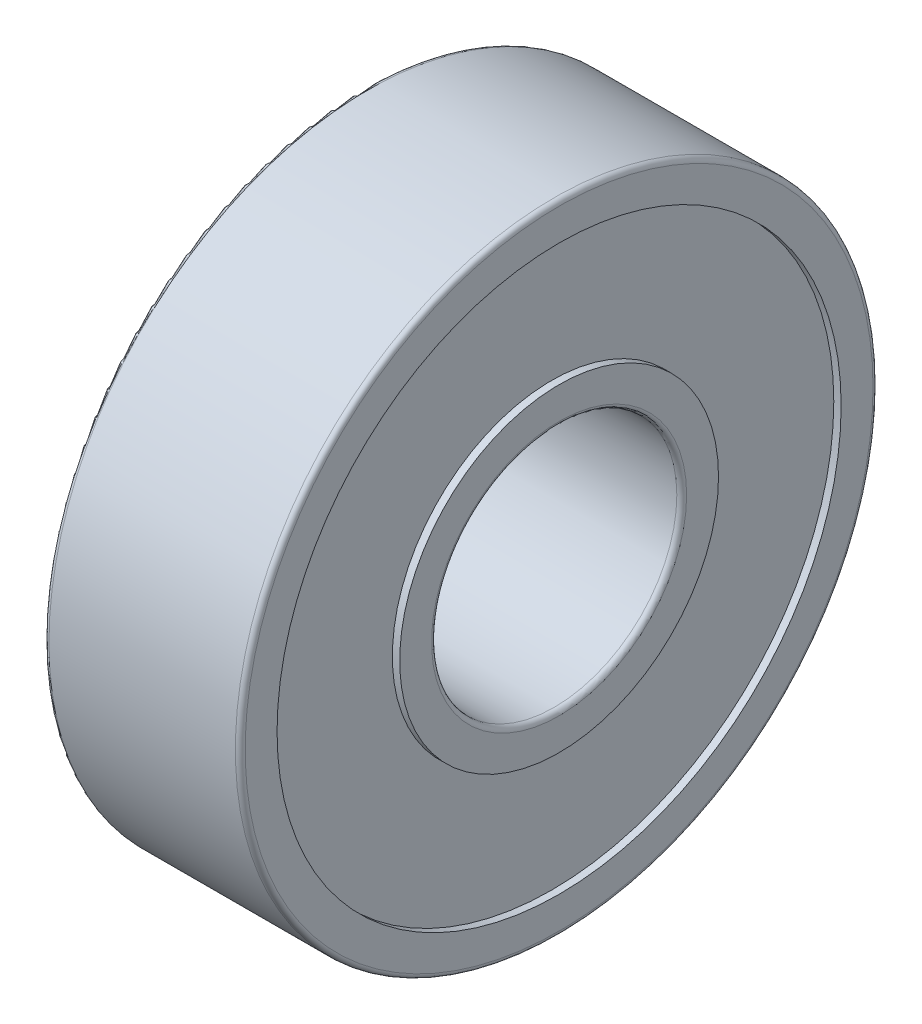
ISO-10303-21;
HEADER;
FILE_DESCRIPTION(('STEP AP214'),'2;1');
FILE_NAME('part.step','',(''),(''),'','','');
FILE_SCHEMA(('AUTOMOTIVE_DESIGN { 1 0 10303 214 1 1 1 1 }'));
ENDSEC;
DATA;
#1=APPLICATION_CONTEXT('core data for automotive mechanical design processes');
#2=APPLICATION_PROTOCOL_DEFINITION('international standard','automotive_design',2000,#1);
#3=PRODUCT_CONTEXT('',#1,'mechanical');
#4=PRODUCT('Part','Part','',(#3));
#5=PRODUCT_RELATED_PRODUCT_CATEGORY('part','',(#4));
#6=PRODUCT_DEFINITION_FORMATION('','',#4);
#7=PRODUCT_DEFINITION_CONTEXT('part definition',#1,'design');
#8=PRODUCT_DEFINITION('design','',#6,#7);
#9=PRODUCT_DEFINITION_SHAPE('','',#8);
#10=(LENGTH_UNIT() NAMED_UNIT(*) SI_UNIT(.MILLI.,.METRE.));
#11=(NAMED_UNIT(*) PLANE_ANGLE_UNIT() SI_UNIT($,.RADIAN.));
#12=(NAMED_UNIT(*) SI_UNIT($,.STERADIAN.) SOLID_ANGLE_UNIT());
#13=UNCERTAINTY_MEASURE_WITH_UNIT(LENGTH_MEASURE(1.E-05),#10,'distance_accuracy_value','');
#14=(GEOMETRIC_REPRESENTATION_CONTEXT(3) GLOBAL_UNCERTAINTY_ASSIGNED_CONTEXT((#13)) GLOBAL_UNIT_ASSIGNED_CONTEXT((#10,
#11,#12)) REPRESENTATION_CONTEXT('',''));
#15=CARTESIAN_POINT('',(0.,0.,0.));
#16=DIRECTION('',(0.,0.,1.));
#17=DIRECTION('',(1.,0.,0.));
#18=AXIS2_PLACEMENT_3D('',#15,#16,#17);
#19=CARTESIAN_POINT('',(-4.,5.,0.));
#20=DIRECTION('',(-1.,0.,0.));
#21=DIRECTION('',(0.,0.,1.));
#22=AXIS2_PLACEMENT_3D('',#19,#20,#21);
#23=PLANE('',#22);
#24=CARTESIAN_POINT('',(-4.,0.,0.));
#25=DIRECTION('',(-1.,0.,0.));
#26=DIRECTION('',(0.,0.,1.));
#27=AXIS2_PLACEMENT_3D('',#24,#25,#26);
#28=CIRCLE('',#27,5.2);
#29=CARTESIAN_POINT('',(-4.,0.,5.2));
#30=VERTEX_POINT('',#29);
#31=EDGE_CURVE('E65',#30,#30,#28,.F.);
#32=ORIENTED_EDGE('',*,*,#31,.T.);
#33=EDGE_LOOP('',(#32));
#34=FACE_BOUND('',#33,.T.);
#35=CARTESIAN_POINT('',(-4.,0.,0.));
#36=DIRECTION('',(1.,0.,0.));
#37=DIRECTION('',(0.,0.,-1.));
#38=AXIS2_PLACEMENT_3D('',#35,#36,#37);
#39=CIRCLE('',#38,6.5);
#40=CARTESIAN_POINT('',(-4.,0.,-6.5));
#41=VERTEX_POINT('',#40);
#42=EDGE_CURVE('E68',#41,#41,#39,.T.);
#43=ORIENTED_EDGE('',*,*,#42,.F.);
#44=EDGE_LOOP('',(#43));
#45=FACE_BOUND('',#44,.T.);
#46=ADVANCED_FACE('F36',(#34,#45),#23,.T.);
#47=CARTESIAN_POINT('',(0.,0.,0.));
#48=DIRECTION('',(1.,0.,0.));
#49=DIRECTION('',(0.,0.,-1.));
#50=AXIS2_PLACEMENT_3D('',#47,#48,#49);
#51=CYLINDRICAL_SURFACE('',#50,6.5);
#52=ORIENTED_EDGE('',*,*,#42,.T.);
#53=EDGE_LOOP('',(#52));
#54=FACE_BOUND('',#53,.T.);
#55=CARTESIAN_POINT('',(-3.7,0.,0.));
#56=DIRECTION('',(1.,0.,0.));
#57=DIRECTION('',(0.,0.,-1.));
#58=AXIS2_PLACEMENT_3D('',#55,#56,#57);
#59=CIRCLE('',#58,6.5);
#60=CARTESIAN_POINT('',(-3.7,0.,-6.5));
#61=VERTEX_POINT('',#60);
#62=EDGE_CURVE('E71',#61,#61,#59,.T.);
#63=ORIENTED_EDGE('',*,*,#62,.F.);
#64=EDGE_LOOP('',(#63));
#65=FACE_BOUND('',#64,.T.);
#66=ADVANCED_FACE('F111',(#54,#65),#51,.T.);
#67=CARTESIAN_POINT('',(-3.7,6.5,0.));
#68=DIRECTION('',(-1.,0.,0.));
#69=DIRECTION('',(0.,0.,1.));
#70=AXIS2_PLACEMENT_3D('',#67,#68,#69);
#71=PLANE('',#70);
#72=ORIENTED_EDGE('',*,*,#62,.T.);
#73=EDGE_LOOP('',(#72));
#74=FACE_BOUND('',#73,.T.);
#75=CARTESIAN_POINT('',(-3.7,0.,0.));
#76=DIRECTION('',(1.,0.,0.));
#77=DIRECTION('',(0.,0.,-1.));
#78=AXIS2_PLACEMENT_3D('',#75,#76,#77);
#79=CIRCLE('',#78,11.5);
#80=CARTESIAN_POINT('',(-3.7,0.,-11.5));
#81=VERTEX_POINT('',#80);
#82=EDGE_CURVE('E74',#81,#81,#79,.T.);
#83=ORIENTED_EDGE('',*,*,#82,.F.);
#84=EDGE_LOOP('',(#83));
#85=FACE_BOUND('',#84,.T.);
#86=ADVANCED_FACE('F117',(#74,#85),#71,.T.);
#87=CARTESIAN_POINT('',(0.,0.,0.));
#88=DIRECTION('',(1.,0.,0.));
#89=DIRECTION('',(0.,0.,-1.));
#90=AXIS2_PLACEMENT_3D('',#87,#88,#89);
#91=CYLINDRICAL_SURFACE('',#90,11.5);
#92=ORIENTED_EDGE('',*,*,#82,.T.);
#93=EDGE_LOOP('',(#92));
#94=FACE_BOUND('',#93,.T.);
#95=CARTESIAN_POINT('',(-4.,0.,0.));
#96=DIRECTION('',(1.,0.,0.));
#97=DIRECTION('',(0.,0.,-1.));
#98=AXIS2_PLACEMENT_3D('',#95,#96,#97);
#99=CIRCLE('',#98,11.5);
#100=CARTESIAN_POINT('',(-4.,0.,-11.5));
#101=VERTEX_POINT('',#100);
#102=EDGE_CURVE('E77',#101,#101,#99,.T.);
#103=ORIENTED_EDGE('',*,*,#102,.F.);
#104=EDGE_LOOP('',(#103));
#105=FACE_BOUND('',#104,.T.);
#106=ADVANCED_FACE('F153',(#94,#105),#91,.F.);
#107=CARTESIAN_POINT('',(-4.,11.5,0.));
#108=DIRECTION('',(-1.,0.,0.));
#109=DIRECTION('',(0.,0.,1.));
#110=AXIS2_PLACEMENT_3D('',#107,#108,#109);
#111=PLANE('',#110);
#112=CARTESIAN_POINT('',(-4.,0.,0.));
#113=DIRECTION('',(-1.,0.,0.));
#114=DIRECTION('',(0.,0.,1.));
#115=AXIS2_PLACEMENT_3D('',#112,#113,#114);
#116=CIRCLE('',#115,12.8);
#117=CARTESIAN_POINT('',(-4.,0.,12.8));
#118=VERTEX_POINT('',#117);
#119=EDGE_CURVE('E43',#118,#118,#116,.T.);
#120=ORIENTED_EDGE('',*,*,#119,.T.);
#121=EDGE_LOOP('',(#120));
#122=FACE_BOUND('',#121,.T.);
#123=ORIENTED_EDGE('',*,*,#102,.T.);
#124=EDGE_LOOP('',(#123));
#125=FACE_BOUND('',#124,.T.);
#126=ADVANCED_FACE('F144',(#122,#125),#111,.T.);
#127=CARTESIAN_POINT('',(0.,0.,0.));
#128=DIRECTION('',(1.,0.,0.));
#129=DIRECTION('',(0.,0.,-1.));
#130=AXIS2_PLACEMENT_3D('',#127,#128,#129);
#131=CYLINDRICAL_SURFACE('',#130,13.);
#132=CARTESIAN_POINT('',(-3.8,0.,0.));
#133=DIRECTION('',(-1.,0.,0.));
#134=DIRECTION('',(0.,0.,1.));
#135=AXIS2_PLACEMENT_3D('',#132,#133,#134);
#136=CIRCLE('',#135,13.);
#137=CARTESIAN_POINT('',(-3.8,0.,13.));
#138=VERTEX_POINT('',#137);
#139=EDGE_CURVE('E47',#138,#138,#136,.F.);
#140=ORIENTED_EDGE('',*,*,#139,.T.);
#141=EDGE_LOOP('',(#140));
#142=FACE_BOUND('',#141,.T.);
#143=CARTESIAN_POINT('',(3.8,0.,0.));
#144=DIRECTION('',(1.,0.,0.));
#145=DIRECTION('',(0.,0.,-1.));
#146=AXIS2_PLACEMENT_3D('',#143,#144,#145);
#147=CIRCLE('',#146,13.);
#148=CARTESIAN_POINT('',(3.8,0.,-13.));
#149=VERTEX_POINT('',#148);
#150=EDGE_CURVE('E51',#149,#149,#147,.F.);
#151=ORIENTED_EDGE('',*,*,#150,.T.);
#152=EDGE_LOOP('',(#151));
#153=FACE_BOUND('',#152,.T.);
#154=ADVANCED_FACE('F140',(#142,#153),#131,.T.);
#155=CARTESIAN_POINT('',(4.,11.5,0.));
#156=DIRECTION('',(1.,0.,0.));
#157=DIRECTION('',(0.,0.,-1.));
#158=AXIS2_PLACEMENT_3D('',#155,#156,#157);
#159=PLANE('',#158);
#160=CARTESIAN_POINT('',(4.,0.,0.));
#161=DIRECTION('',(1.,0.,0.));
#162=DIRECTION('',(0.,0.,-1.));
#163=AXIS2_PLACEMENT_3D('',#160,#161,#162);
#164=CIRCLE('',#163,12.8);
#165=CARTESIAN_POINT('',(4.,0.,-12.8));
#166=VERTEX_POINT('',#165);
#167=EDGE_CURVE('E10',#166,#166,#164,.T.);
#168=ORIENTED_EDGE('',*,*,#167,.T.);
#169=EDGE_LOOP('',(#168));
#170=FACE_BOUND('',#169,.T.);
#171=CARTESIAN_POINT('',(4.,0.,0.));
#172=DIRECTION('',(1.,0.,0.));
#173=DIRECTION('',(0.,0.,-1.));
#174=AXIS2_PLACEMENT_3D('',#171,#172,#173);
#175=CIRCLE('',#174,11.5);
#176=CARTESIAN_POINT('',(4.,0.,-11.5));
#177=VERTEX_POINT('',#176);
#178=EDGE_CURVE('E80',#177,#177,#175,.T.);
#179=ORIENTED_EDGE('',*,*,#178,.F.);
#180=EDGE_LOOP('',(#179));
#181=FACE_BOUND('',#180,.T.);
#182=ADVANCED_FACE('F143',(#170,#181),#159,.T.);
#183=CARTESIAN_POINT('',(0.,0.,0.));
#184=DIRECTION('',(1.,0.,0.));
#185=DIRECTION('',(0.,0.,-1.));
#186=AXIS2_PLACEMENT_3D('',#183,#184,#185);
#187=CYLINDRICAL_SURFACE('',#186,11.5);
#188=ORIENTED_EDGE('',*,*,#178,.T.);
#189=EDGE_LOOP('',(#188));
#190=FACE_BOUND('',#189,.T.);
#191=CARTESIAN_POINT('',(3.7,0.,0.));
#192=DIRECTION('',(1.,0.,0.));
#193=DIRECTION('',(0.,0.,-1.));
#194=AXIS2_PLACEMENT_3D('',#191,#192,#193);
#195=CIRCLE('',#194,11.5);
#196=CARTESIAN_POINT('',(3.7,0.,-11.5));
#197=VERTEX_POINT('',#196);
#198=EDGE_CURVE('E83',#197,#197,#195,.T.);
#199=ORIENTED_EDGE('',*,*,#198,.F.);
#200=EDGE_LOOP('',(#199));
#201=FACE_BOUND('',#200,.T.);
#202=ADVANCED_FACE('F107',(#190,#201),#187,.F.);
#203=CARTESIAN_POINT('',(3.7,6.5,0.));
#204=DIRECTION('',(1.,0.,0.));
#205=DIRECTION('',(0.,0.,-1.));
#206=AXIS2_PLACEMENT_3D('',#203,#204,#205);
#207=PLANE('',#206);
#208=ORIENTED_EDGE('',*,*,#198,.T.);
#209=EDGE_LOOP('',(#208));
#210=FACE_BOUND('',#209,.T.);
#211=CARTESIAN_POINT('',(3.7,0.,0.));
#212=DIRECTION('',(1.,0.,0.));
#213=DIRECTION('',(0.,0.,-1.));
#214=AXIS2_PLACEMENT_3D('',#211,#212,#213);
#215=CIRCLE('',#214,6.5);
#216=CARTESIAN_POINT('',(3.7,0.,-6.5));
#217=VERTEX_POINT('',#216);
#218=EDGE_CURVE('E86',#217,#217,#215,.T.);
#219=ORIENTED_EDGE('',*,*,#218,.F.);
#220=EDGE_LOOP('',(#219));
#221=FACE_BOUND('',#220,.T.);
#222=ADVANCED_FACE('F97',(#210,#221),#207,.T.);
#223=CARTESIAN_POINT('',(0.,0.,0.));
#224=DIRECTION('',(1.,0.,0.));
#225=DIRECTION('',(0.,0.,-1.));
#226=AXIS2_PLACEMENT_3D('',#223,#224,#225);
#227=CYLINDRICAL_SURFACE('',#226,6.5);
#228=ORIENTED_EDGE('',*,*,#218,.T.);
#229=EDGE_LOOP('',(#228));
#230=FACE_BOUND('',#229,.T.);
#231=CARTESIAN_POINT('',(4.,0.,0.));
#232=DIRECTION('',(1.,0.,0.));
#233=DIRECTION('',(0.,0.,-1.));
#234=AXIS2_PLACEMENT_3D('',#231,#232,#233);
#235=CIRCLE('',#234,6.5);
#236=CARTESIAN_POINT('',(4.,0.,-6.5));
#237=VERTEX_POINT('',#236);
#238=EDGE_CURVE('E89',#237,#237,#235,.T.);
#239=ORIENTED_EDGE('',*,*,#238,.F.);
#240=EDGE_LOOP('',(#239));
#241=FACE_BOUND('',#240,.T.);
#242=ADVANCED_FACE('F95',(#230,#241),#227,.T.);
#243=CARTESIAN_POINT('',(4.,5.,0.));
#244=DIRECTION('',(1.,0.,0.));
#245=DIRECTION('',(0.,0.,-1.));
#246=AXIS2_PLACEMENT_3D('',#243,#244,#245);
#247=PLANE('',#246);
#248=CARTESIAN_POINT('',(4.,0.,0.));
#249=DIRECTION('',(1.,0.,0.));
#250=DIRECTION('',(0.,0.,-1.));
#251=AXIS2_PLACEMENT_3D('',#248,#249,#250);
#252=CIRCLE('',#251,5.2);
#253=CARTESIAN_POINT('',(4.,0.,-5.2));
#254=VERTEX_POINT('',#253);
#255=EDGE_CURVE('E56',#254,#254,#252,.F.);
#256=ORIENTED_EDGE('',*,*,#255,.T.);
#257=EDGE_LOOP('',(#256));
#258=FACE_BOUND('',#257,.T.);
#259=ORIENTED_EDGE('',*,*,#238,.T.);
#260=EDGE_LOOP('',(#259));
#261=FACE_BOUND('',#260,.T.);
#262=ADVANCED_FACE('F93',(#258,#261),#247,.T.);
#263=CARTESIAN_POINT('',(0.,0.,0.));
#264=DIRECTION('',(1.,0.,0.));
#265=DIRECTION('',(0.,0.,-1.));
#266=AXIS2_PLACEMENT_3D('',#263,#264,#265);
#267=CYLINDRICAL_SURFACE('',#266,5.);
#268=CARTESIAN_POINT('',(-3.8,0.,0.));
#269=DIRECTION('',(-1.,0.,0.));
#270=DIRECTION('',(0.,0.,1.));
#271=AXIS2_PLACEMENT_3D('',#268,#269,#270);
#272=CIRCLE('',#271,5.);
#273=CARTESIAN_POINT('',(-3.8,0.,5.));
#274=VERTEX_POINT('',#273);
#275=EDGE_CURVE('E59',#274,#274,#272,.T.);
#276=ORIENTED_EDGE('',*,*,#275,.T.);
#277=EDGE_LOOP('',(#276));
#278=FACE_BOUND('',#277,.T.);
#279=CARTESIAN_POINT('',(3.8,0.,0.));
#280=DIRECTION('',(1.,0.,0.));
#281=DIRECTION('',(0.,0.,-1.));
#282=AXIS2_PLACEMENT_3D('',#279,#280,#281);
#283=CIRCLE('',#282,5.);
#284=CARTESIAN_POINT('',(3.8,0.,-5.));
#285=VERTEX_POINT('',#284);
#286=EDGE_CURVE('E62',#285,#285,#283,.T.);
#287=ORIENTED_EDGE('',*,*,#286,.T.);
#288=EDGE_LOOP('',(#287));
#289=FACE_BOUND('',#288,.T.);
#290=ADVANCED_FACE('F104',(#278,#289),#267,.F.);
#291=CARTESIAN_POINT('',(-3.8,0.,0.));
#292=DIRECTION('',(-1.,0.,0.));
#293=DIRECTION('',(0.,0.,1.));
#294=AXIS2_PLACEMENT_3D('',#291,#292,#293);
#295=TOROIDAL_SURFACE('',#294,5.2,0.2);
#296=ORIENTED_EDGE('',*,*,#275,.F.);
#297=EDGE_LOOP('',(#296));
#298=FACE_BOUND('',#297,.T.);
#299=ORIENTED_EDGE('',*,*,#31,.F.);
#300=EDGE_LOOP('',(#299));
#301=FACE_BOUND('',#300,.T.);
#302=ADVANCED_FACE('F123',(#298,#301),#295,.T.);
#303=CARTESIAN_POINT('',(3.8,0.,0.));
#304=DIRECTION('',(1.,0.,0.));
#305=DIRECTION('',(0.,0.,-1.));
#306=AXIS2_PLACEMENT_3D('',#303,#304,#305);
#307=TOROIDAL_SURFACE('',#306,5.2,0.2);
#308=ORIENTED_EDGE('',*,*,#255,.F.);
#309=EDGE_LOOP('',(#308));
#310=FACE_BOUND('',#309,.T.);
#311=ORIENTED_EDGE('',*,*,#286,.F.);
#312=EDGE_LOOP('',(#311));
#313=FACE_BOUND('',#312,.T.);
#314=ADVANCED_FACE('F126',(#310,#313),#307,.T.);
#315=CARTESIAN_POINT('',(-3.8,0.,0.));
#316=DIRECTION('',(-1.,0.,0.));
#317=DIRECTION('',(0.,0.,1.));
#318=AXIS2_PLACEMENT_3D('',#315,#316,#317);
#319=TOROIDAL_SURFACE('',#318,12.8,0.2);
#320=ORIENTED_EDGE('',*,*,#119,.F.);
#321=EDGE_LOOP('',(#320));
#322=FACE_BOUND('',#321,.T.);
#323=ORIENTED_EDGE('',*,*,#139,.F.);
#324=EDGE_LOOP('',(#323));
#325=FACE_BOUND('',#324,.T.);
#326=ADVANCED_FACE('F129',(#322,#325),#319,.T.);
#327=CARTESIAN_POINT('',(3.8,0.,0.));
#328=DIRECTION('',(1.,0.,0.));
#329=DIRECTION('',(0.,0.,-1.));
#330=AXIS2_PLACEMENT_3D('',#327,#328,#329);
#331=TOROIDAL_SURFACE('',#330,12.8,0.2);
#332=ORIENTED_EDGE('',*,*,#150,.F.);
#333=EDGE_LOOP('',(#332));
#334=FACE_BOUND('',#333,.T.);
#335=ORIENTED_EDGE('',*,*,#167,.F.);
#336=EDGE_LOOP('',(#335));
#337=FACE_BOUND('',#336,.T.);
#338=ADVANCED_FACE('F38',(#334,#337),#331,.T.);
#339=CLOSED_SHELL('',(#46,#66,#86,#106,#126,#154,#182,#202,#222,#242,#262,#290,#302,#314,#326,#338));
#340=MANIFOLD_SOLID_BREP('B2',#339);
#341=ADVANCED_BREP_SHAPE_REPRESENTATION('',(#18,#340),#14);
#342=SHAPE_DEFINITION_REPRESENTATION(#9,#341);
ENDSEC;
END-ISO-10303-21;
